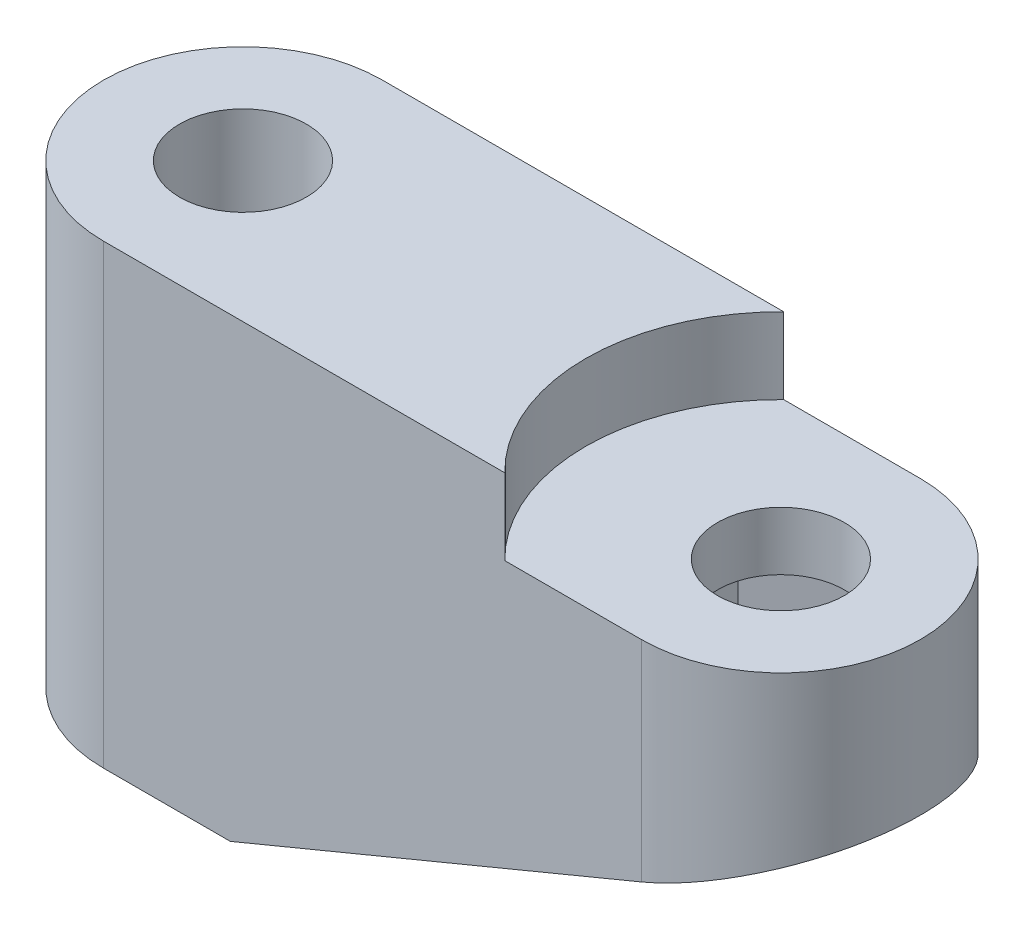
ISO-10303-21;
HEADER;
FILE_DESCRIPTION(('STEP AP214'),'2;1');
FILE_NAME('part.step','',(''),(''),'','','');
FILE_SCHEMA(('AUTOMOTIVE_DESIGN { 1 0 10303 214 1 1 1 1 }'));
ENDSEC;
DATA;
#1=APPLICATION_CONTEXT('core data for automotive mechanical design processes');
#2=APPLICATION_PROTOCOL_DEFINITION('international standard','automotive_design',2000,#1);
#3=PRODUCT_CONTEXT('',#1,'mechanical');
#4=PRODUCT('Part','Part','',(#3));
#5=PRODUCT_RELATED_PRODUCT_CATEGORY('part','',(#4));
#6=PRODUCT_DEFINITION_FORMATION('','',#4);
#7=PRODUCT_DEFINITION_CONTEXT('part definition',#1,'design');
#8=PRODUCT_DEFINITION('design','',#6,#7);
#9=PRODUCT_DEFINITION_SHAPE('','',#8);
#10=(LENGTH_UNIT() NAMED_UNIT(*) SI_UNIT(.MILLI.,.METRE.));
#11=(NAMED_UNIT(*) PLANE_ANGLE_UNIT() SI_UNIT($,.RADIAN.));
#12=(NAMED_UNIT(*) SI_UNIT($,.STERADIAN.) SOLID_ANGLE_UNIT());
#13=UNCERTAINTY_MEASURE_WITH_UNIT(LENGTH_MEASURE(1.E-05),#10,'distance_accuracy_value','');
#14=(GEOMETRIC_REPRESENTATION_CONTEXT(3) GLOBAL_UNCERTAINTY_ASSIGNED_CONTEXT((#13)) GLOBAL_UNIT_ASSIGNED_CONTEXT((#10,
#11,#12)) REPRESENTATION_CONTEXT('',''));
#15=CARTESIAN_POINT('',(0.,0.,0.));
#16=DIRECTION('',(0.,0.,1.));
#17=DIRECTION('',(1.,0.,0.));
#18=AXIS2_PLACEMENT_3D('',#15,#16,#17);
#19=CARTESIAN_POINT('',(0.,15.,0.));
#20=DIRECTION('',(0.,1.,0.));
#21=DIRECTION('',(0.,0.,1.));
#22=AXIS2_PLACEMENT_3D('',#19,#20,#21);
#23=PLANE('',#22);
#24=CARTESIAN_POINT('',(21.215,15.,0.));
#25=DIRECTION('',(0.,1.,0.));
#26=DIRECTION('',(0.,0.,1.));
#27=AXIS2_PLACEMENT_3D('',#24,#25,#26);
#28=CIRCLE('',#27,2.5);
#29=CARTESIAN_POINT('',(21.215,15.,2.5));
#30=VERTEX_POINT('',#29);
#31=EDGE_CURVE('E205',#30,#30,#28,.T.);
#32=ORIENTED_EDGE('',*,*,#31,.F.);
#33=EDGE_LOOP('',(#32));
#34=FACE_BOUND('',#33,.T.);
#35=CARTESIAN_POINT('',(21.215,15.,0.));
#36=DIRECTION('',(0.,-1.,0.));
#37=DIRECTION('',(0.,0.,1.));
#38=AXIS2_PLACEMENT_3D('',#35,#36,#37);
#39=CIRCLE('',#38,7.7);
#40=CARTESIAN_POINT('',(15.826122565877,15.,5.5));
#41=VERTEX_POINT('',#40);
#42=CARTESIAN_POINT('',(15.826122565877,15.,-5.5));
#43=VERTEX_POINT('',#42);
#44=EDGE_CURVE('E49',#41,#43,#39,.T.);
#45=ORIENTED_EDGE('',*,*,#44,.F.);
#46=DIRECTION('',(1.,0.,0.));
#47=VECTOR('',#46,1.);
#48=CARTESIAN_POINT('',(0.,15.,5.5));
#49=LINE('',#48,#47);
#50=CARTESIAN_POINT('',(21.215,15.,5.5));
#51=VERTEX_POINT('',#50);
#52=EDGE_CURVE('E211',#41,#51,#49,.T.);
#53=ORIENTED_EDGE('',*,*,#52,.T.);
#54=CARTESIAN_POINT('',(21.215,15.,0.));
#55=DIRECTION('',(0.,1.,0.));
#56=DIRECTION('',(0.,0.,1.));
#57=AXIS2_PLACEMENT_3D('',#54,#55,#56);
#58=CIRCLE('',#57,5.5);
#59=CARTESIAN_POINT('',(21.215,15.,-5.5));
#60=VERTEX_POINT('',#59);
#61=EDGE_CURVE('E213',#51,#60,#58,.T.);
#62=ORIENTED_EDGE('',*,*,#61,.T.);
#63=DIRECTION('',(-1.,0.,0.));
#64=VECTOR('',#63,1.);
#65=CARTESIAN_POINT('',(0.,15.,-5.5));
#66=LINE('',#65,#64);
#67=EDGE_CURVE('E216',#60,#43,#66,.T.);
#68=ORIENTED_EDGE('',*,*,#67,.T.);
#69=EDGE_LOOP('',(#45,#53,#62,#68));
#70=FACE_BOUND('',#69,.T.);
#71=ADVANCED_FACE('F33',(#34,#70),#23,.T.);
#72=CARTESIAN_POINT('',(5.,0.,-9.5));
#73=DIRECTION('',(-0.3828777828103,0.923799005969518,0.));
#74=DIRECTION('',(-0.923799005969518,-0.3828777828103,0.));
#75=AXIS2_PLACEMENT_3D('',#72,#73,#74);
#76=PLANE('',#75);
#77=DIRECTION('',(-0.923799005969518,-0.3828777828103,0.));
#78=VECTOR('',#77,1.);
#79=CARTESIAN_POINT('',(5.,0.,5.5));
#80=LINE('',#79,#78);
#81=CARTESIAN_POINT('',(21.215,6.72046972139074,5.5));
#82=VERTEX_POINT('',#81);
#83=CARTESIAN_POINT('',(5.,0.,5.5));
#84=VERTEX_POINT('',#83);
#85=EDGE_CURVE('E195',#82,#84,#80,.T.);
#86=ORIENTED_EDGE('',*,*,#85,.T.);
#87=DIRECTION('',(0.,0.,1.));
#88=VECTOR('',#87,1.);
#89=CARTESIAN_POINT('',(5.,0.,-9.5));
#90=LINE('',#89,#88);
#91=CARTESIAN_POINT('',(4.99999999999998,0.,-5.5));
#92=VERTEX_POINT('',#91);
#93=EDGE_CURVE('E197',#92,#84,#90,.T.);
#94=ORIENTED_EDGE('',*,*,#93,.F.);
#95=DIRECTION('',(-0.923799005969518,-0.3828777828103,0.));
#96=VECTOR('',#95,1.);
#97=CARTESIAN_POINT('',(6.03850871036817,0.430420372706129,-5.5));
#98=LINE('',#97,#96);
#99=CARTESIAN_POINT('',(21.215,6.72046972139075,-5.5));
#100=VERTEX_POINT('',#99);
#101=EDGE_CURVE('E200',#100,#92,#98,.T.);
#102=ORIENTED_EDGE('',*,*,#101,.F.);
#103=CARTESIAN_POINT('',(21.215,6.72046972139075,0.));
#104=DIRECTION('',(-0.3828777828103,0.923799005969518,0.));
#105=DIRECTION('',(-0.923799005969518,-0.3828777828103,0.));
#106=AXIS2_PLACEMENT_3D('',#103,#104,#105);
#107=ELLIPSE('',#106,5.9536760317552,5.5);
#108=EDGE_CURVE('E203',#82,#100,#107,.T.);
#109=ORIENTED_EDGE('',*,*,#108,.F.);
#110=EDGE_LOOP('',(#86,#94,#102,#109));
#111=FACE_BOUND('',#110,.T.);
#112=DIRECTION('',(0.81510923200009,0.337830213585117,-0.470603534514201));
#113=VECTOR('',#112,1.);
#114=CARTESIAN_POINT('',(10.4634932593648,2.26439969303628,1.58858315738282));
#115=LINE('',#114,#113);
#116=CARTESIAN_POINT('',(17.215,5.06262951876583,-2.3094010767585));
#117=VERTEX_POINT('',#116);
#118=CARTESIAN_POINT('',(21.215,6.72046972139075,-4.61880215351701));
#119=VERTEX_POINT('',#118);
#120=EDGE_CURVE('E11',#117,#119,#115,.T.);
#121=ORIENTED_EDGE('',*,*,#120,.F.);
#122=DIRECTION('',(0.,0.,-1.));
#123=VECTOR('',#122,1.);
#124=CARTESIAN_POINT('',(17.215,5.06262951876583,-9.5));
#125=LINE('',#124,#123);
#126=CARTESIAN_POINT('',(17.215,5.06262951876583,2.3094010767585));
#127=VERTEX_POINT('',#126);
#128=EDGE_CURVE('E42',#127,#117,#125,.T.);
#129=ORIENTED_EDGE('',*,*,#128,.F.);
#130=DIRECTION('',(-0.815109232000089,-0.337830213585117,-0.470603534514201));
#131=VECTOR('',#130,1.);
#132=CARTESIAN_POINT('',(3.1752208330712,-0.75629806596174,-5.79646920463075));
#133=LINE('',#132,#131);
#134=CARTESIAN_POINT('',(21.215,6.72046972139075,4.61880215351701));
#135=VERTEX_POINT('',#134);
#136=EDGE_CURVE('E234',#135,#127,#133,.T.);
#137=ORIENTED_EDGE('',*,*,#136,.F.);
#138=DIRECTION('',(-0.81510923200009,-0.337830213585117,0.470603534514201));
#139=VECTOR('',#138,1.);
#140=CARTESIAN_POINT('',(14.0069762465209,3.7330318313925,8.78035660791338));
#141=LINE('',#140,#139);
#142=CARTESIAN_POINT('',(25.215,8.37830992401566,2.3094010767585));
#143=VERTEX_POINT('',#142);
#144=EDGE_CURVE('E232',#143,#135,#141,.T.);
#145=ORIENTED_EDGE('',*,*,#144,.F.);
#146=DIRECTION('',(0.,0.,1.));
#147=VECTOR('',#146,1.);
#148=CARTESIAN_POINT('',(25.215,8.37830992401566,-9.5));
#149=LINE('',#148,#147);
#150=CARTESIAN_POINT('',(25.215,8.37830992401566,-2.3094010767585));
#151=VERTEX_POINT('',#150);
#152=EDGE_CURVE('E230',#151,#143,#149,.T.);
#153=ORIENTED_EDGE('',*,*,#152,.F.);
#154=DIRECTION('',(0.815109232000089,0.337830213585117,0.470603534514202));
#155=VECTOR('',#154,1.);
#156=CARTESIAN_POINT('',(6.71870382022735,0.71233407239448,-12.9882426551613));
#157=LINE('',#156,#155);
#158=EDGE_CURVE('E138',#119,#151,#157,.T.);
#159=ORIENTED_EDGE('',*,*,#158,.F.);
#160=EDGE_LOOP('',(#121,#129,#137,#145,#153,#159));
#161=FACE_BOUND('',#160,.T.);
#162=ADVANCED_FACE('F248',(#111,#161),#76,.F.);
#163=CARTESIAN_POINT('',(0.,0.,0.));
#164=DIRECTION('',(0.,1.,0.));
#165=DIRECTION('',(0.,0.,1.));
#166=AXIS2_PLACEMENT_3D('',#163,#164,#165);
#167=PLANE('',#166);
#168=DIRECTION('',(-1.,0.,0.));
#169=VECTOR('',#168,1.);
#170=CARTESIAN_POINT('',(0.,0.,-5.5));
#171=LINE('',#170,#169);
#172=CARTESIAN_POINT('',(0.,0.,-5.5));
#173=VERTEX_POINT('',#172);
#174=EDGE_CURVE('E214',#92,#173,#171,.T.);
#175=ORIENTED_EDGE('',*,*,#174,.F.);
#176=ORIENTED_EDGE('',*,*,#93,.T.);
#177=DIRECTION('',(1.,0.,0.));
#178=VECTOR('',#177,1.);
#179=CARTESIAN_POINT('',(0.,0.,5.5));
#180=LINE('',#179,#178);
#181=CARTESIAN_POINT('',(0.,0.,5.5));
#182=VERTEX_POINT('',#181);
#183=EDGE_CURVE('E220',#182,#84,#180,.T.);
#184=ORIENTED_EDGE('',*,*,#183,.F.);
#185=CARTESIAN_POINT('',(0.,0.,0.));
#186=DIRECTION('',(0.,1.,0.));
#187=DIRECTION('',(0.,0.,1.));
#188=AXIS2_PLACEMENT_3D('',#185,#186,#187);
#189=CIRCLE('',#188,5.5);
#190=EDGE_CURVE('E135',#173,#182,#189,.T.);
#191=ORIENTED_EDGE('',*,*,#190,.F.);
#192=EDGE_LOOP('',(#175,#176,#184,#191));
#193=FACE_BOUND('',#192,.T.);
#194=CARTESIAN_POINT('',(0.,0.,0.));
#195=DIRECTION('',(0.,1.,0.));
#196=DIRECTION('',(0.,0.,1.));
#197=AXIS2_PLACEMENT_3D('',#194,#195,#196);
#198=CIRCLE('',#197,2.5);
#199=CARTESIAN_POINT('',(0.,0.,2.5));
#200=VERTEX_POINT('',#199);
#201=EDGE_CURVE('E208',#200,#200,#198,.T.);
#202=ORIENTED_EDGE('',*,*,#201,.T.);
#203=EDGE_LOOP('',(#202));
#204=FACE_BOUND('',#203,.T.);
#205=ADVANCED_FACE('F281',(#193,#204),#167,.F.);
#206=CARTESIAN_POINT('',(0.,15.,0.));
#207=DIRECTION('',(0.,-1.,0.));
#208=DIRECTION('',(0.,0.,-1.));
#209=AXIS2_PLACEMENT_3D('',#206,#207,#208);
#210=CYLINDRICAL_SURFACE('',#209,5.5);
#211=ORIENTED_EDGE('',*,*,#190,.T.);
#212=DIRECTION('',(0.,-1.,0.));
#213=VECTOR('',#212,1.);
#214=CARTESIAN_POINT('',(0.,15.,5.5));
#215=LINE('',#214,#213);
#216=CARTESIAN_POINT('',(0.,18.,5.5));
#217=VERTEX_POINT('',#216);
#218=EDGE_CURVE('E129',#217,#182,#215,.T.);
#219=ORIENTED_EDGE('',*,*,#218,.F.);
#220=CARTESIAN_POINT('',(0.,18.,0.));
#221=DIRECTION('',(0.,1.,0.));
#222=DIRECTION('',(0.,0.,1.));
#223=AXIS2_PLACEMENT_3D('',#220,#221,#222);
#224=CIRCLE('',#223,5.5);
#225=CARTESIAN_POINT('',(0.,18.,-5.5));
#226=VERTEX_POINT('',#225);
#227=EDGE_CURVE('E133',#226,#217,#224,.T.);
#228=ORIENTED_EDGE('',*,*,#227,.F.);
#229=DIRECTION('',(0.,-1.,0.));
#230=VECTOR('',#229,1.);
#231=CARTESIAN_POINT('',(0.,15.,-5.5));
#232=LINE('',#231,#230);
#233=EDGE_CURVE('E218',#226,#173,#232,.T.);
#234=ORIENTED_EDGE('',*,*,#233,.T.);
#235=EDGE_LOOP('',(#211,#219,#228,#234));
#236=FACE_BOUND('',#235,.T.);
#237=ADVANCED_FACE('F35',(#236),#210,.T.);
#238=CARTESIAN_POINT('',(0.,15.,5.5));
#239=DIRECTION('',(0.,0.,-1.));
#240=DIRECTION('',(-1.,0.,0.));
#241=AXIS2_PLACEMENT_3D('',#238,#239,#240);
#242=PLANE('',#241);
#243=ORIENTED_EDGE('',*,*,#183,.T.);
#244=ORIENTED_EDGE('',*,*,#85,.F.);
#245=DIRECTION('',(0.,-1.,0.));
#246=VECTOR('',#245,1.);
#247=CARTESIAN_POINT('',(21.215,15.,5.5));
#248=LINE('',#247,#246);
#249=EDGE_CURVE('E139',#51,#82,#248,.T.);
#250=ORIENTED_EDGE('',*,*,#249,.F.);
#251=ORIENTED_EDGE('',*,*,#52,.F.);
#252=DIRECTION('',(0.,-1.,0.));
#253=VECTOR('',#252,1.);
#254=CARTESIAN_POINT('',(15.826122565877,18.,5.5));
#255=LINE('',#254,#253);
#256=CARTESIAN_POINT('',(15.826122565877,18.,5.5));
#257=VERTEX_POINT('',#256);
#258=EDGE_CURVE('E145',#257,#41,#255,.T.);
#259=ORIENTED_EDGE('',*,*,#258,.F.);
#260=DIRECTION('',(1.,0.,0.));
#261=VECTOR('',#260,1.);
#262=CARTESIAN_POINT('',(0.,18.,5.5));
#263=LINE('',#262,#261);
#264=EDGE_CURVE('E142',#217,#257,#263,.T.);
#265=ORIENTED_EDGE('',*,*,#264,.F.);
#266=ORIENTED_EDGE('',*,*,#218,.T.);
#267=EDGE_LOOP('',(#243,#244,#250,#251,#259,#265,#266));
#268=FACE_BOUND('',#267,.T.);
#269=ADVANCED_FACE('F143',(#268),#242,.F.);
#270=CARTESIAN_POINT('',(21.215,15.,0.));
#271=DIRECTION('',(0.,-1.,0.));
#272=DIRECTION('',(0.,0.,-1.));
#273=AXIS2_PLACEMENT_3D('',#270,#271,#272);
#274=CYLINDRICAL_SURFACE('',#273,5.5);
#275=ORIENTED_EDGE('',*,*,#249,.T.);
#276=ORIENTED_EDGE('',*,*,#108,.T.);
#277=DIRECTION('',(0.,-1.,0.));
#278=VECTOR('',#277,1.);
#279=CARTESIAN_POINT('',(21.215,15.,-5.5));
#280=LINE('',#279,#278);
#281=EDGE_CURVE('E224',#60,#100,#280,.T.);
#282=ORIENTED_EDGE('',*,*,#281,.F.);
#283=ORIENTED_EDGE('',*,*,#61,.F.);
#284=EDGE_LOOP('',(#275,#276,#282,#283));
#285=FACE_BOUND('',#284,.T.);
#286=ADVANCED_FACE('F295',(#285),#274,.T.);
#287=CARTESIAN_POINT('',(0.,15.,-5.5));
#288=DIRECTION('',(0.,0.,1.));
#289=DIRECTION('',(1.,0.,0.));
#290=AXIS2_PLACEMENT_3D('',#287,#288,#289);
#291=PLANE('',#290);
#292=ORIENTED_EDGE('',*,*,#281,.T.);
#293=ORIENTED_EDGE('',*,*,#101,.T.);
#294=ORIENTED_EDGE('',*,*,#174,.T.);
#295=ORIENTED_EDGE('',*,*,#233,.F.);
#296=DIRECTION('',(-1.,0.,0.));
#297=VECTOR('',#296,1.);
#298=CARTESIAN_POINT('',(15.826122565877,18.,-5.5));
#299=LINE('',#298,#297);
#300=CARTESIAN_POINT('',(15.826122565877,18.,-5.5));
#301=VERTEX_POINT('',#300);
#302=EDGE_CURVE('E154',#301,#226,#299,.T.);
#303=ORIENTED_EDGE('',*,*,#302,.F.);
#304=DIRECTION('',(0.,-1.,0.));
#305=VECTOR('',#304,1.);
#306=CARTESIAN_POINT('',(15.826122565877,18.,-5.5));
#307=LINE('',#306,#305);
#308=EDGE_CURVE('E161',#301,#43,#307,.T.);
#309=ORIENTED_EDGE('',*,*,#308,.T.);
#310=ORIENTED_EDGE('',*,*,#67,.F.);
#311=EDGE_LOOP('',(#292,#293,#294,#295,#303,#309,#310));
#312=FACE_BOUND('',#311,.T.);
#313=ADVANCED_FACE('F292',(#312),#291,.F.);
#314=CARTESIAN_POINT('',(0.,15.,0.));
#315=DIRECTION('',(0.,-1.,0.));
#316=DIRECTION('',(0.,0.,-1.));
#317=AXIS2_PLACEMENT_3D('',#314,#315,#316);
#318=CYLINDRICAL_SURFACE('',#317,2.5);
#319=ORIENTED_EDGE('',*,*,#201,.F.);
#320=EDGE_LOOP('',(#319));
#321=FACE_BOUND('',#320,.T.);
#322=CARTESIAN_POINT('',(0.,18.,0.));
#323=DIRECTION('',(0.,1.,0.));
#324=DIRECTION('',(0.,0.,1.));
#325=AXIS2_PLACEMENT_3D('',#322,#323,#324);
#326=CIRCLE('',#325,2.5);
#327=CARTESIAN_POINT('',(0.,18.,2.5));
#328=VERTEX_POINT('',#327);
#329=EDGE_CURVE('E156',#328,#328,#326,.T.);
#330=ORIENTED_EDGE('',*,*,#329,.T.);
#331=EDGE_LOOP('',(#330));
#332=FACE_BOUND('',#331,.T.);
#333=ADVANCED_FACE('F287',(#321,#332),#318,.F.);
#334=CARTESIAN_POINT('',(21.215,15.,0.));
#335=DIRECTION('',(0.,-1.,0.));
#336=DIRECTION('',(0.,0.,-1.));
#337=AXIS2_PLACEMENT_3D('',#334,#335,#336);
#338=CYLINDRICAL_SURFACE('',#337,2.5);
#339=CARTESIAN_POINT('',(21.215,12.7,0.));
#340=DIRECTION('',(0.,1.,0.));
#341=DIRECTION('',(0.,0.,1.));
#342=AXIS2_PLACEMENT_3D('',#339,#340,#341);
#343=CIRCLE('',#342,2.5);
#344=CARTESIAN_POINT('',(21.215,12.7,2.5));
#345=VERTEX_POINT('',#344);
#346=EDGE_CURVE('E37',#345,#345,#343,.T.);
#347=ORIENTED_EDGE('',*,*,#346,.F.);
#348=EDGE_LOOP('',(#347));
#349=FACE_BOUND('',#348,.T.);
#350=ORIENTED_EDGE('',*,*,#31,.T.);
#351=EDGE_LOOP('',(#350));
#352=FACE_BOUND('',#351,.T.);
#353=ADVANCED_FACE('F323',(#349,#352),#338,.F.);
#354=CARTESIAN_POINT('',(21.215,12.7,-4.61880215351701));
#355=DIRECTION('',(0.5,0.,0.866025403784439));
#356=DIRECTION('',(0.866025403784439,0.,-0.5));
#357=AXIS2_PLACEMENT_3D('',#354,#355,#356);
#358=PLANE('',#357);
#359=ORIENTED_EDGE('',*,*,#120,.T.);
#360=DIRECTION('',(0.,-1.,0.));
#361=VECTOR('',#360,1.);
#362=CARTESIAN_POINT('',(21.215,12.7,-4.61880215351701));
#363=LINE('',#362,#361);
#364=CARTESIAN_POINT('',(21.215,12.7,-4.61880215351701));
#365=VERTEX_POINT('',#364);
#366=EDGE_CURVE('E57',#365,#119,#363,.T.);
#367=ORIENTED_EDGE('',*,*,#366,.F.);
#368=DIRECTION('',(-0.866025403784439,0.,0.5));
#369=VECTOR('',#368,1.);
#370=CARTESIAN_POINT('',(21.215,12.7,-4.61880215351701));
#371=LINE('',#370,#369);
#372=CARTESIAN_POINT('',(17.215,12.7,-2.3094010767585));
#373=VERTEX_POINT('',#372);
#374=EDGE_CURVE('E166',#365,#373,#371,.T.);
#375=ORIENTED_EDGE('',*,*,#374,.T.);
#376=DIRECTION('',(0.,-1.,0.));
#377=VECTOR('',#376,1.);
#378=CARTESIAN_POINT('',(17.215,12.7,-2.3094010767585));
#379=LINE('',#378,#377);
#380=EDGE_CURVE('E192',#373,#117,#379,.T.);
#381=ORIENTED_EDGE('',*,*,#380,.T.);
#382=EDGE_LOOP('',(#359,#367,#375,#381));
#383=FACE_BOUND('',#382,.T.);
#384=ADVANCED_FACE('F245',(#383),#358,.T.);
#385=CARTESIAN_POINT('',(17.215,12.7,-2.3094010767585));
#386=DIRECTION('',(1.,0.,0.));
#387=DIRECTION('',(0.,0.,-1.));
#388=AXIS2_PLACEMENT_3D('',#385,#386,#387);
#389=PLANE('',#388);
#390=ORIENTED_EDGE('',*,*,#128,.T.);
#391=ORIENTED_EDGE('',*,*,#380,.F.);
#392=DIRECTION('',(0.,0.,1.));
#393=VECTOR('',#392,1.);
#394=CARTESIAN_POINT('',(17.215,12.7,-2.3094010767585));
#395=LINE('',#394,#393);
#396=CARTESIAN_POINT('',(17.215,12.7,2.3094010767585));
#397=VERTEX_POINT('',#396);
#398=EDGE_CURVE('E169',#373,#397,#395,.T.);
#399=ORIENTED_EDGE('',*,*,#398,.T.);
#400=DIRECTION('',(0.,-1.,0.));
#401=VECTOR('',#400,1.);
#402=CARTESIAN_POINT('',(17.215,12.7,2.3094010767585));
#403=LINE('',#402,#401);
#404=EDGE_CURVE('E189',#397,#127,#403,.T.);
#405=ORIENTED_EDGE('',*,*,#404,.T.);
#406=EDGE_LOOP('',(#390,#391,#399,#405));
#407=FACE_BOUND('',#406,.T.);
#408=ADVANCED_FACE('F239',(#407),#389,.T.);
#409=CARTESIAN_POINT('',(17.215,12.7,2.3094010767585));
#410=DIRECTION('',(0.5,0.,-0.866025403784438));
#411=DIRECTION('',(-0.866025403784439,0.,-0.5));
#412=AXIS2_PLACEMENT_3D('',#409,#410,#411);
#413=PLANE('',#412);
#414=ORIENTED_EDGE('',*,*,#136,.T.);
#415=ORIENTED_EDGE('',*,*,#404,.F.);
#416=DIRECTION('',(0.866025403784439,0.,0.5));
#417=VECTOR('',#416,1.);
#418=CARTESIAN_POINT('',(17.215,12.7,2.3094010767585));
#419=LINE('',#418,#417);
#420=CARTESIAN_POINT('',(21.215,12.7,4.61880215351701));
#421=VERTEX_POINT('',#420);
#422=EDGE_CURVE('E171',#397,#421,#419,.T.);
#423=ORIENTED_EDGE('',*,*,#422,.T.);
#424=DIRECTION('',(0.,-1.,0.));
#425=VECTOR('',#424,1.);
#426=CARTESIAN_POINT('',(21.215,12.7,4.61880215351701));
#427=LINE('',#426,#425);
#428=EDGE_CURVE('E186',#421,#135,#427,.T.);
#429=ORIENTED_EDGE('',*,*,#428,.T.);
#430=EDGE_LOOP('',(#414,#415,#423,#429));
#431=FACE_BOUND('',#430,.T.);
#432=ADVANCED_FACE('F263',(#431),#413,.T.);
#433=CARTESIAN_POINT('',(21.215,12.7,4.61880215351701));
#434=DIRECTION('',(-0.5,0.,-0.866025403784439));
#435=DIRECTION('',(-0.866025403784439,0.,0.5));
#436=AXIS2_PLACEMENT_3D('',#433,#434,#435);
#437=PLANE('',#436);
#438=ORIENTED_EDGE('',*,*,#144,.T.);
#439=ORIENTED_EDGE('',*,*,#428,.F.);
#440=DIRECTION('',(0.866025403784439,0.,-0.5));
#441=VECTOR('',#440,1.);
#442=CARTESIAN_POINT('',(21.215,12.7,4.61880215351701));
#443=LINE('',#442,#441);
#444=CARTESIAN_POINT('',(25.215,12.7,2.3094010767585));
#445=VERTEX_POINT('',#444);
#446=EDGE_CURVE('E173',#421,#445,#443,.T.);
#447=ORIENTED_EDGE('',*,*,#446,.T.);
#448=DIRECTION('',(0.,-1.,0.));
#449=VECTOR('',#448,1.);
#450=CARTESIAN_POINT('',(25.215,12.7,2.3094010767585));
#451=LINE('',#450,#449);
#452=EDGE_CURVE('E183',#445,#143,#451,.T.);
#453=ORIENTED_EDGE('',*,*,#452,.T.);
#454=EDGE_LOOP('',(#438,#439,#447,#453));
#455=FACE_BOUND('',#454,.T.);
#456=ADVANCED_FACE('F266',(#455),#437,.T.);
#457=CARTESIAN_POINT('',(25.215,12.7,2.3094010767585));
#458=DIRECTION('',(-1.,0.,0.));
#459=DIRECTION('',(0.,0.,1.));
#460=AXIS2_PLACEMENT_3D('',#457,#458,#459);
#461=PLANE('',#460);
#462=ORIENTED_EDGE('',*,*,#152,.T.);
#463=ORIENTED_EDGE('',*,*,#452,.F.);
#464=DIRECTION('',(0.,0.,-1.));
#465=VECTOR('',#464,1.);
#466=CARTESIAN_POINT('',(25.215,12.7,2.3094010767585));
#467=LINE('',#466,#465);
#468=CARTESIAN_POINT('',(25.215,12.7,-2.30940107675851));
#469=VERTEX_POINT('',#468);
#470=EDGE_CURVE('E175',#445,#469,#467,.T.);
#471=ORIENTED_EDGE('',*,*,#470,.T.);
#472=DIRECTION('',(0.,-1.,0.));
#473=VECTOR('',#472,1.);
#474=CARTESIAN_POINT('',(25.215,12.7,-2.30940107675851));
#475=LINE('',#474,#473);
#476=EDGE_CURVE('E180',#469,#151,#475,.T.);
#477=ORIENTED_EDGE('',*,*,#476,.T.);
#478=EDGE_LOOP('',(#462,#463,#471,#477));
#479=FACE_BOUND('',#478,.T.);
#480=ADVANCED_FACE('F255',(#479),#461,.T.);
#481=CARTESIAN_POINT('',(25.215,12.7,-2.30940107675851));
#482=DIRECTION('',(-0.500000000000001,0.,0.866025403784438));
#483=DIRECTION('',(0.866025403784438,0.,0.500000000000001));
#484=AXIS2_PLACEMENT_3D('',#481,#482,#483);
#485=PLANE('',#484);
#486=ORIENTED_EDGE('',*,*,#158,.T.);
#487=ORIENTED_EDGE('',*,*,#476,.F.);
#488=DIRECTION('',(-0.866025403784438,0.,-0.500000000000001));
#489=VECTOR('',#488,1.);
#490=CARTESIAN_POINT('',(25.215,12.7,-2.30940107675851));
#491=LINE('',#490,#489);
#492=EDGE_CURVE('E177',#469,#365,#491,.T.);
#493=ORIENTED_EDGE('',*,*,#492,.T.);
#494=ORIENTED_EDGE('',*,*,#366,.T.);
#495=EDGE_LOOP('',(#486,#487,#493,#494));
#496=FACE_BOUND('',#495,.T.);
#497=ADVANCED_FACE('F252',(#496),#485,.T.);
#498=CARTESIAN_POINT('',(0.,12.7,0.));
#499=DIRECTION('',(0.,1.,0.));
#500=DIRECTION('',(0.,0.,1.));
#501=AXIS2_PLACEMENT_3D('',#498,#499,#500);
#502=PLANE('',#501);
#503=ORIENTED_EDGE('',*,*,#346,.T.);
#504=EDGE_LOOP('',(#503));
#505=FACE_BOUND('',#504,.T.);
#506=ORIENTED_EDGE('',*,*,#374,.F.);
#507=ORIENTED_EDGE('',*,*,#492,.F.);
#508=ORIENTED_EDGE('',*,*,#470,.F.);
#509=ORIENTED_EDGE('',*,*,#446,.F.);
#510=ORIENTED_EDGE('',*,*,#422,.F.);
#511=ORIENTED_EDGE('',*,*,#398,.F.);
#512=EDGE_LOOP('',(#506,#507,#508,#509,#510,#511));
#513=FACE_BOUND('',#512,.T.);
#514=ADVANCED_FACE('F260',(#505,#513),#502,.F.);
#515=CARTESIAN_POINT('',(0.,18.,0.));
#516=DIRECTION('',(0.,1.,0.));
#517=DIRECTION('',(0.,0.,1.));
#518=AXIS2_PLACEMENT_3D('',#515,#516,#517);
#519=PLANE('',#518);
#520=ORIENTED_EDGE('',*,*,#227,.T.);
#521=ORIENTED_EDGE('',*,*,#264,.T.);
#522=CARTESIAN_POINT('',(21.215,18.,0.));
#523=DIRECTION('',(0.,-1.,0.));
#524=DIRECTION('',(0.,0.,1.));
#525=AXIS2_PLACEMENT_3D('',#522,#523,#524);
#526=CIRCLE('',#525,7.7);
#527=EDGE_CURVE('E148',#257,#301,#526,.T.);
#528=ORIENTED_EDGE('',*,*,#527,.T.);
#529=ORIENTED_EDGE('',*,*,#302,.T.);
#530=EDGE_LOOP('',(#520,#521,#528,#529));
#531=FACE_BOUND('',#530,.T.);
#532=ORIENTED_EDGE('',*,*,#329,.F.);
#533=EDGE_LOOP('',(#532));
#534=FACE_BOUND('',#533,.T.);
#535=ADVANCED_FACE('F151',(#531,#534),#519,.T.);
#536=CARTESIAN_POINT('',(21.215,18.,0.));
#537=DIRECTION('',(0.,-1.,0.));
#538=DIRECTION('',(0.,0.,-1.));
#539=AXIS2_PLACEMENT_3D('',#536,#537,#538);
#540=CYLINDRICAL_SURFACE('',#539,7.7);
#541=ORIENTED_EDGE('',*,*,#44,.T.);
#542=ORIENTED_EDGE('',*,*,#308,.F.);
#543=ORIENTED_EDGE('',*,*,#527,.F.);
#544=ORIENTED_EDGE('',*,*,#258,.T.);
#545=EDGE_LOOP('',(#541,#542,#543,#544));
#546=FACE_BOUND('',#545,.T.);
#547=ADVANCED_FACE('F418',(#546),#540,.F.);
#548=CLOSED_SHELL('',(#71,#162,#205,#237,#269,#286,#313,#333,#353,#384,#408,#432,#456,#480,#497,
#514,#535,#547));
#549=MANIFOLD_SOLID_BREP('B2',#548);
#550=ADVANCED_BREP_SHAPE_REPRESENTATION('',(#18,#549),#14);
#551=SHAPE_DEFINITION_REPRESENTATION(#9,#550);
ENDSEC;
END-ISO-10303-21;
